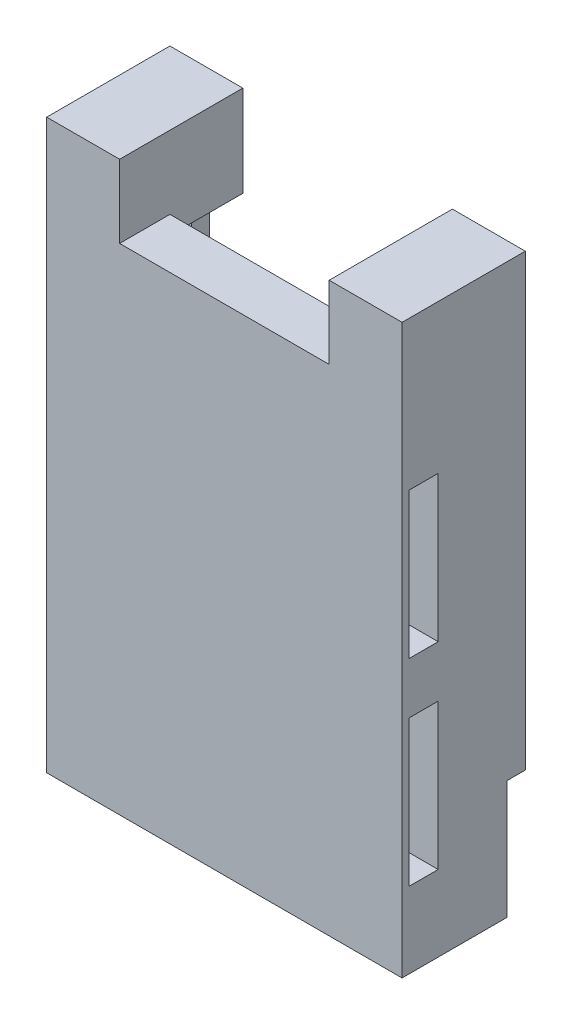
ISO-10303-21;
HEADER;
FILE_DESCRIPTION(('STEP AP214'),'2;1');
FILE_NAME('part.step','',(''),(''),'','','');
FILE_SCHEMA(('AUTOMOTIVE_DESIGN { 1 0 10303 214 1 1 1 1 }'));
ENDSEC;
DATA;
#1=APPLICATION_CONTEXT('core data for automotive mechanical design processes');
#2=APPLICATION_PROTOCOL_DEFINITION('international standard','automotive_design',2000,#1);
#3=PRODUCT_CONTEXT('',#1,'mechanical');
#4=PRODUCT('Part','Part','',(#3));
#5=PRODUCT_RELATED_PRODUCT_CATEGORY('part','',(#4));
#6=PRODUCT_DEFINITION_FORMATION('','',#4);
#7=PRODUCT_DEFINITION_CONTEXT('part definition',#1,'design');
#8=PRODUCT_DEFINITION('design','',#6,#7);
#9=PRODUCT_DEFINITION_SHAPE('','',#8);
#10=(LENGTH_UNIT() NAMED_UNIT(*) SI_UNIT(.MILLI.,.METRE.));
#11=(NAMED_UNIT(*) PLANE_ANGLE_UNIT() SI_UNIT($,.RADIAN.));
#12=(NAMED_UNIT(*) SI_UNIT($,.STERADIAN.) SOLID_ANGLE_UNIT());
#13=UNCERTAINTY_MEASURE_WITH_UNIT(LENGTH_MEASURE(1.E-05),#10,'distance_accuracy_value','');
#14=(GEOMETRIC_REPRESENTATION_CONTEXT(3) GLOBAL_UNCERTAINTY_ASSIGNED_CONTEXT((#13)) GLOBAL_UNIT_ASSIGNED_CONTEXT((#10,
#11,#12)) REPRESENTATION_CONTEXT('',''));
#15=CARTESIAN_POINT('',(0.,0.,0.));
#16=DIRECTION('',(0.,0.,1.));
#17=DIRECTION('',(1.,0.,0.));
#18=AXIS2_PLACEMENT_3D('',#15,#16,#17);
#19=CARTESIAN_POINT('',(30.9499,83.0326,-17.9858508435529));
#20=DIRECTION('',(0.,0.,1.));
#21=DIRECTION('',(1.,0.,0.));
#22=AXIS2_PLACEMENT_3D('',#19,#20,#21);
#23=PLANE('',#22);
#24=DIRECTION('',(0.,1.,0.));
#25=VECTOR('',#24,1.);
#26=CARTESIAN_POINT('',(-18.2499,83.0326,-17.9858508435529));
#27=LINE('',#26,#25);
#28=CARTESIAN_POINT('',(-18.2499,83.0326,-17.9858508435529));
#29=VERTEX_POINT('',#28);
#30=CARTESIAN_POINT('',(-18.2499,98.9076,-17.9858508435529));
#31=VERTEX_POINT('',#30);
#32=EDGE_CURVE('E284',#29,#31,#27,.T.);
#33=ORIENTED_EDGE('',*,*,#32,.F.);
#34=DIRECTION('',(-1.,0.,0.));
#35=VECTOR('',#34,1.);
#36=CARTESIAN_POINT('',(30.9499,83.0326,-17.9858508435529));
#37=LINE('',#36,#35);
#38=CARTESIAN_POINT('',(-24.0411,83.0326,-17.9858508435529));
#39=VERTEX_POINT('',#38);
#40=EDGE_CURVE('E382',#29,#39,#37,.T.);
#41=ORIENTED_EDGE('',*,*,#40,.T.);
#42=DIRECTION('',(0.,-1.,0.));
#43=VECTOR('',#42,1.);
#44=CARTESIAN_POINT('',(-24.0411,83.0326,-17.9858508435529));
#45=LINE('',#44,#43);
#46=CARTESIAN_POINT('',(-24.0411,20.63242,-17.9858508435529));
#47=VERTEX_POINT('',#46);
#48=EDGE_CURVE('E237',#39,#47,#45,.T.);
#49=ORIENTED_EDGE('',*,*,#48,.T.);
#50=DIRECTION('',(1.,0.,0.));
#51=VECTOR('',#50,1.);
#52=CARTESIAN_POINT('',(30.9499,20.63242,-17.9858508435529));
#53=LINE('',#52,#51);
#54=CARTESIAN_POINT('',(-30.9499,20.63242,-17.9858508435529));
#55=VERTEX_POINT('',#54);
#56=EDGE_CURVE('E236',#55,#47,#53,.T.);
#57=ORIENTED_EDGE('',*,*,#56,.F.);
#58=DIRECTION('',(0.,-1.,0.));
#59=VECTOR('',#58,1.);
#60=CARTESIAN_POINT('',(-30.9499,83.0326,-17.9858508435529));
#61=LINE('',#60,#59);
#62=CARTESIAN_POINT('',(-30.9499,98.9076,-17.9858508435529));
#63=VERTEX_POINT('',#62);
#64=EDGE_CURVE('E229',#63,#55,#61,.T.);
#65=ORIENTED_EDGE('',*,*,#64,.F.);
#66=DIRECTION('',(-1.,0.,0.));
#67=VECTOR('',#66,1.);
#68=CARTESIAN_POINT('',(-18.2499,98.9076,-17.9858508435529));
#69=LINE('',#68,#67);
#70=EDGE_CURVE('E234',#31,#63,#69,.T.);
#71=ORIENTED_EDGE('',*,*,#70,.F.);
#72=EDGE_LOOP('',(#33,#41,#49,#57,#65,#71));
#73=FACE_BOUND('',#72,.T.);
#74=ADVANCED_FACE('F39',(#73),#23,.F.);
#75=CARTESIAN_POINT('',(0.,83.0326,0.));
#76=DIRECTION('',(0.,1.,0.));
#77=DIRECTION('',(0.,0.,1.));
#78=AXIS2_PLACEMENT_3D('',#75,#76,#77);
#79=PLANE('',#78);
#80=DIRECTION('',(-1.,0.,0.));
#81=VECTOR('',#80,1.);
#82=CARTESIAN_POINT('',(27.7749,83.0326,-5.28585084355286));
#83=LINE('',#82,#81);
#84=CARTESIAN_POINT('',(27.7749,83.0326,-5.28585084355286));
#85=VERTEX_POINT('',#84);
#86=CARTESIAN_POINT('',(18.2499,83.0326,-5.28585084355286));
#87=VERTEX_POINT('',#86);
#88=EDGE_CURVE('E400',#85,#87,#83,.T.);
#89=ORIENTED_EDGE('',*,*,#88,.T.);
#90=DIRECTION('',(0.,0.,-1.));
#91=VECTOR('',#90,1.);
#92=CARTESIAN_POINT('',(18.2499,83.0326,-5.28585084355286));
#93=LINE('',#92,#91);
#94=CARTESIAN_POINT('',(18.2499,83.0326,-17.9858508435529));
#95=VERTEX_POINT('',#94);
#96=EDGE_CURVE('E276',#87,#95,#93,.T.);
#97=ORIENTED_EDGE('',*,*,#96,.T.);
#98=CARTESIAN_POINT('',(24.0411,83.0326,-17.9858508435529));
#99=VERTEX_POINT('',#98);
#100=EDGE_CURVE('E383',#99,#95,#37,.T.);
#101=ORIENTED_EDGE('',*,*,#100,.F.);
#102=DIRECTION('',(0.,0.,1.));
#103=VECTOR('',#102,1.);
#104=CARTESIAN_POINT('',(24.0411,83.0326,-17.9858508435529));
#105=LINE('',#104,#103);
#106=CARTESIAN_POINT('',(24.0411,83.0326,-14.8108508435529));
#107=VERTEX_POINT('',#106);
#108=EDGE_CURVE('E407',#99,#107,#105,.T.);
#109=ORIENTED_EDGE('',*,*,#108,.T.);
#110=DIRECTION('',(1.,0.,0.));
#111=VECTOR('',#110,1.);
#112=CARTESIAN_POINT('',(24.0411,83.0326,-14.8108508435529));
#113=LINE('',#112,#111);
#114=CARTESIAN_POINT('',(27.7749,83.0326,-14.8108508435529));
#115=VERTEX_POINT('',#114);
#116=EDGE_CURVE('E404',#107,#115,#113,.T.);
#117=ORIENTED_EDGE('',*,*,#116,.T.);
#118=DIRECTION('',(0.,0.,1.));
#119=VECTOR('',#118,1.);
#120=CARTESIAN_POINT('',(27.7749,83.0326,-14.8108508435529));
#121=LINE('',#120,#119);
#122=EDGE_CURVE('E405',#115,#85,#121,.T.);
#123=ORIENTED_EDGE('',*,*,#122,.T.);
#124=EDGE_LOOP('',(#89,#97,#101,#109,#117,#123));
#125=FACE_BOUND('',#124,.T.);
#126=ADVANCED_FACE('F481',(#125),#79,.F.);
#127=CARTESIAN_POINT('',(30.9499,83.0326,-17.9858508435529));
#128=DIRECTION('',(1.,0.,0.));
#129=DIRECTION('',(0.,0.,-1.));
#130=AXIS2_PLACEMENT_3D('',#127,#128,#129);
#131=PLANE('',#130);
#132=DIRECTION('',(0.,0.,-1.));
#133=VECTOR('',#132,1.);
#134=CARTESIAN_POINT('',(30.9499,72.9836457596635,0.));
#135=LINE('',#134,#133);
#136=CARTESIAN_POINT('',(30.9499,72.9836457596635,2.2655468417995));
#137=VERTEX_POINT('',#136);
#138=CARTESIAN_POINT('',(30.9499,72.9836457596635,-2.8144531582005));
#139=VERTEX_POINT('',#138);
#140=EDGE_CURVE('E320',#137,#139,#135,.T.);
#141=ORIENTED_EDGE('',*,*,#140,.T.);
#142=DIRECTION('',(0.,-1.,0.));
#143=VECTOR('',#142,1.);
#144=CARTESIAN_POINT('',(30.9499,0.,-2.81445315820049));
#145=LINE('',#144,#143);
#146=CARTESIAN_POINT('',(30.9499,47.5836457596635,-2.8144531582005));
#147=VERTEX_POINT('',#146);
#148=EDGE_CURVE('E318',#139,#147,#145,.T.);
#149=ORIENTED_EDGE('',*,*,#148,.T.);
#150=DIRECTION('',(0.,0.,-1.));
#151=VECTOR('',#150,1.);
#152=CARTESIAN_POINT('',(30.9499,47.5836457596635,0.));
#153=LINE('',#152,#151);
#154=CARTESIAN_POINT('',(30.9499,47.5836457596635,2.2655468417995));
#155=VERTEX_POINT('',#154);
#156=EDGE_CURVE('E321',#155,#147,#153,.T.);
#157=ORIENTED_EDGE('',*,*,#156,.F.);
#158=DIRECTION('',(0.,-1.,0.));
#159=VECTOR('',#158,1.);
#160=CARTESIAN_POINT('',(30.9499,0.,2.26554684179951));
#161=LINE('',#160,#159);
#162=EDGE_CURVE('E329',#137,#155,#161,.T.);
#163=ORIENTED_EDGE('',*,*,#162,.F.);
#164=EDGE_LOOP('',(#141,#149,#157,#163));
#165=FACE_BOUND('',#164,.T.);
#166=DIRECTION('',(0.,1.,0.));
#167=VECTOR('',#166,1.);
#168=CARTESIAN_POINT('',(30.9499,13.2239542403365,-2.8144531582005));
#169=LINE('',#168,#167);
#170=CARTESIAN_POINT('',(30.9499,13.2239542403365,-2.8144531582005));
#171=VERTEX_POINT('',#170);
#172=CARTESIAN_POINT('',(30.9499,38.6239542403365,-2.8144531582005));
#173=VERTEX_POINT('',#172);
#174=EDGE_CURVE('E380',#171,#173,#169,.T.);
#175=ORIENTED_EDGE('',*,*,#174,.F.);
#176=DIRECTION('',(0.,0.,-1.));
#177=VECTOR('',#176,1.);
#178=CARTESIAN_POINT('',(30.9499,13.2239542403365,2.2655468417995));
#179=LINE('',#178,#177);
#180=CARTESIAN_POINT('',(30.9499,13.2239542403365,2.2655468417995));
#181=VERTEX_POINT('',#180);
#182=EDGE_CURVE('E364',#181,#171,#179,.T.);
#183=ORIENTED_EDGE('',*,*,#182,.F.);
#184=DIRECTION('',(0.,1.,0.));
#185=VECTOR('',#184,1.);
#186=CARTESIAN_POINT('',(30.9499,13.2239542403365,2.2655468417995));
#187=LINE('',#186,#185);
#188=CARTESIAN_POINT('',(30.9499,38.6239542403365,2.2655468417995));
#189=VERTEX_POINT('',#188);
#190=EDGE_CURVE('E360',#181,#189,#187,.T.);
#191=ORIENTED_EDGE('',*,*,#190,.T.);
#192=DIRECTION('',(0.,0.,-1.));
#193=VECTOR('',#192,1.);
#194=CARTESIAN_POINT('',(30.9499,38.6239542403365,2.2655468417995));
#195=LINE('',#194,#193);
#196=EDGE_CURVE('E372',#189,#173,#195,.T.);
#197=ORIENTED_EDGE('',*,*,#196,.T.);
#198=EDGE_LOOP('',(#175,#183,#191,#197));
#199=FACE_BOUND('',#198,.T.);
#200=DIRECTION('',(0.,-1.,0.));
#201=VECTOR('',#200,1.);
#202=CARTESIAN_POINT('',(30.9499,20.63242,-14.8108508435529));
#203=LINE('',#202,#201);
#204=CARTESIAN_POINT('',(30.9499,20.63242,-14.8108508435529));
#205=VERTEX_POINT('',#204);
#206=CARTESIAN_POINT('',(30.9499,0.,-14.8108508435529));
#207=VERTEX_POINT('',#206);
#208=EDGE_CURVE('E291',#205,#207,#203,.T.);
#209=ORIENTED_EDGE('',*,*,#208,.F.);
#210=DIRECTION('',(0.,0.,-1.));
#211=VECTOR('',#210,1.);
#212=CARTESIAN_POINT('',(30.9499,20.63242,-14.8108508435529));
#213=LINE('',#212,#211);
#214=CARTESIAN_POINT('',(30.9499,20.63242,-17.9858508435529));
#215=VERTEX_POINT('',#214);
#216=EDGE_CURVE('E310',#205,#215,#213,.T.);
#217=ORIENTED_EDGE('',*,*,#216,.T.);
#218=DIRECTION('',(0.,-1.,0.));
#219=VECTOR('',#218,1.);
#220=CARTESIAN_POINT('',(30.9499,83.0326,-17.9858508435529));
#221=LINE('',#220,#219);
#222=CARTESIAN_POINT('',(30.9499,98.9076,-17.9858508435529));
#223=VERTEX_POINT('',#222);
#224=EDGE_CURVE('E422',#223,#215,#221,.T.);
#225=ORIENTED_EDGE('',*,*,#224,.F.);
#226=DIRECTION('',(0.,0.,-1.));
#227=VECTOR('',#226,1.);
#228=CARTESIAN_POINT('',(30.9499,98.9076,3.47714915644712));
#229=LINE('',#228,#227);
#230=CARTESIAN_POINT('',(30.9499,98.9076,3.47714915644712));
#231=VERTEX_POINT('',#230);
#232=EDGE_CURVE('E268',#231,#223,#229,.T.);
#233=ORIENTED_EDGE('',*,*,#232,.F.);
#234=DIRECTION('',(0.,-1.,0.));
#235=VECTOR('',#234,1.);
#236=CARTESIAN_POINT('',(30.9499,83.0326,3.47714915644712));
#237=LINE('',#236,#235);
#238=CARTESIAN_POINT('',(30.9499,0.,3.47714915644712));
#239=VERTEX_POINT('',#238);
#240=EDGE_CURVE('E409',#231,#239,#237,.T.);
#241=ORIENTED_EDGE('',*,*,#240,.T.);
#242=DIRECTION('',(0.,0.,1.));
#243=VECTOR('',#242,1.);
#244=CARTESIAN_POINT('',(30.9499,0.,-17.9858508435529));
#245=LINE('',#244,#243);
#246=EDGE_CURVE('E381',#207,#239,#245,.T.);
#247=ORIENTED_EDGE('',*,*,#246,.F.);
#248=EDGE_LOOP('',(#209,#217,#225,#233,#241,#247));
#249=FACE_BOUND('',#248,.T.);
#250=ADVANCED_FACE('F41',(#165,#199,#249),#131,.T.);
#251=CARTESIAN_POINT('',(-30.9499,83.0326,-17.9858508435529));
#252=DIRECTION('',(1.,0.,0.));
#253=DIRECTION('',(0.,0.,-1.));
#254=AXIS2_PLACEMENT_3D('',#251,#252,#253);
#255=PLANE('',#254);
#256=DIRECTION('',(0.,0.,-1.));
#257=VECTOR('',#256,1.);
#258=CARTESIAN_POINT('',(-30.9499,13.2239542403365,2.2655468417995));
#259=LINE('',#258,#257);
#260=CARTESIAN_POINT('',(-30.9499,13.2239542403365,2.2655468417995));
#261=VERTEX_POINT('',#260);
#262=CARTESIAN_POINT('',(-30.9499,13.2239542403365,-2.8144531582005));
#263=VERTEX_POINT('',#262);
#264=EDGE_CURVE('E332',#261,#263,#259,.T.);
#265=ORIENTED_EDGE('',*,*,#264,.T.);
#266=DIRECTION('',(0.,1.,0.));
#267=VECTOR('',#266,1.);
#268=CARTESIAN_POINT('',(-30.9499,13.2239542403365,-2.8144531582005));
#269=LINE('',#268,#267);
#270=CARTESIAN_POINT('',(-30.9499,38.6239542403365,-2.8144531582005));
#271=VERTEX_POINT('',#270);
#272=EDGE_CURVE('E370',#263,#271,#269,.T.);
#273=ORIENTED_EDGE('',*,*,#272,.T.);
#274=DIRECTION('',(0.,0.,-1.));
#275=VECTOR('',#274,1.);
#276=CARTESIAN_POINT('',(-30.9499,38.6239542403365,2.2655468417995));
#277=LINE('',#276,#275);
#278=CARTESIAN_POINT('',(-30.9499,38.6239542403365,2.2655468417995));
#279=VERTEX_POINT('',#278);
#280=EDGE_CURVE('E361',#279,#271,#277,.T.);
#281=ORIENTED_EDGE('',*,*,#280,.F.);
#282=DIRECTION('',(0.,1.,0.));
#283=VECTOR('',#282,1.);
#284=CARTESIAN_POINT('',(-30.9499,13.2239542403365,2.2655468417995));
#285=LINE('',#284,#283);
#286=EDGE_CURVE('E359',#261,#279,#285,.T.);
#287=ORIENTED_EDGE('',*,*,#286,.F.);
#288=EDGE_LOOP('',(#265,#273,#281,#287));
#289=FACE_BOUND('',#288,.T.);
#290=DIRECTION('',(0.,-1.,0.));
#291=VECTOR('',#290,1.);
#292=CARTESIAN_POINT('',(-30.9499,0.,-2.81445315820049));
#293=LINE('',#292,#291);
#294=CARTESIAN_POINT('',(-30.9499,72.9836457596635,-2.8144531582005));
#295=VERTEX_POINT('',#294);
#296=CARTESIAN_POINT('',(-30.9499,47.5836457596635,-2.8144531582005));
#297=VERTEX_POINT('',#296);
#298=EDGE_CURVE('E334',#295,#297,#293,.T.);
#299=ORIENTED_EDGE('',*,*,#298,.F.);
#300=DIRECTION('',(0.,0.,-1.));
#301=VECTOR('',#300,1.);
#302=CARTESIAN_POINT('',(-30.9499,72.9836457596635,0.));
#303=LINE('',#302,#301);
#304=CARTESIAN_POINT('',(-30.9499,72.9836457596635,2.2655468417995));
#305=VERTEX_POINT('',#304);
#306=EDGE_CURVE('E328',#305,#295,#303,.T.);
#307=ORIENTED_EDGE('',*,*,#306,.F.);
#308=DIRECTION('',(0.,-1.,0.));
#309=VECTOR('',#308,1.);
#310=CARTESIAN_POINT('',(-30.9499,0.,2.26554684179951));
#311=LINE('',#310,#309);
#312=CARTESIAN_POINT('',(-30.9499,47.5836457596635,2.2655468417995));
#313=VERTEX_POINT('',#312);
#314=EDGE_CURVE('E322',#305,#313,#311,.T.);
#315=ORIENTED_EDGE('',*,*,#314,.T.);
#316=DIRECTION('',(0.,0.,-1.));
#317=VECTOR('',#316,1.);
#318=CARTESIAN_POINT('',(-30.9499,47.5836457596635,0.));
#319=LINE('',#318,#317);
#320=EDGE_CURVE('E337',#313,#297,#319,.T.);
#321=ORIENTED_EDGE('',*,*,#320,.T.);
#322=EDGE_LOOP('',(#299,#307,#315,#321));
#323=FACE_BOUND('',#322,.T.);
#324=DIRECTION('',(0.,1.,0.));
#325=VECTOR('',#324,1.);
#326=CARTESIAN_POINT('',(-30.9499,0.,-14.8108508435529));
#327=LINE('',#326,#325);
#328=CARTESIAN_POINT('',(-30.9499,0.,-14.8108508435529));
#329=VERTEX_POINT('',#328);
#330=CARTESIAN_POINT('',(-30.9499,20.63242,-14.8108508435529));
#331=VERTEX_POINT('',#330);
#332=EDGE_CURVE('E300',#329,#331,#327,.T.);
#333=ORIENTED_EDGE('',*,*,#332,.F.);
#334=DIRECTION('',(0.,0.,1.));
#335=VECTOR('',#334,1.);
#336=CARTESIAN_POINT('',(-30.9499,0.,-17.9858508435529));
#337=LINE('',#336,#335);
#338=CARTESIAN_POINT('',(-30.9499,0.,3.47714915644714));
#339=VERTEX_POINT('',#338);
#340=EDGE_CURVE('E415',#329,#339,#337,.T.);
#341=ORIENTED_EDGE('',*,*,#340,.T.);
#342=DIRECTION('',(0.,-1.,0.));
#343=VECTOR('',#342,1.);
#344=CARTESIAN_POINT('',(-30.9499,83.0326,3.47714915644714));
#345=LINE('',#344,#343);
#346=CARTESIAN_POINT('',(-30.9499,98.9076,3.47714915644714));
#347=VERTEX_POINT('',#346);
#348=EDGE_CURVE('E239',#347,#339,#345,.T.);
#349=ORIENTED_EDGE('',*,*,#348,.F.);
#350=DIRECTION('',(0.,0.,1.));
#351=VECTOR('',#350,1.);
#352=CARTESIAN_POINT('',(-30.9499,98.9076,-17.9858508435529));
#353=LINE('',#352,#351);
#354=EDGE_CURVE('E243',#63,#347,#353,.T.);
#355=ORIENTED_EDGE('',*,*,#354,.F.);
#356=ORIENTED_EDGE('',*,*,#64,.T.);
#357=DIRECTION('',(0.,0.,-1.));
#358=VECTOR('',#357,1.);
#359=CARTESIAN_POINT('',(-30.9499,20.63242,-14.8108508435529));
#360=LINE('',#359,#358);
#361=EDGE_CURVE('E302',#331,#55,#360,.T.);
#362=ORIENTED_EDGE('',*,*,#361,.F.);
#363=EDGE_LOOP('',(#333,#341,#349,#355,#356,#362));
#364=FACE_BOUND('',#363,.T.);
#365=ADVANCED_FACE('F244',(#289,#323,#364),#255,.F.);
#366=CARTESIAN_POINT('',(-24.0411,83.0326,-14.8108508435529));
#367=DIRECTION('',(0.,0.,1.));
#368=DIRECTION('',(1.,0.,0.));
#369=AXIS2_PLACEMENT_3D('',#366,#367,#368);
#370=PLANE('',#369);
#371=DIRECTION('',(0.,-1.,0.));
#372=VECTOR('',#371,1.);
#373=CARTESIAN_POINT('',(-27.7749,83.0326,-14.8108508435529));
#374=LINE('',#373,#372);
#375=CARTESIAN_POINT('',(-27.7749,83.0326,-14.8108508435529));
#376=VERTEX_POINT('',#375);
#377=CARTESIAN_POINT('',(-27.7749,20.63242,-14.8108508435529));
#378=VERTEX_POINT('',#377);
#379=EDGE_CURVE('E437',#376,#378,#374,.T.);
#380=ORIENTED_EDGE('',*,*,#379,.T.);
#381=DIRECTION('',(1.,0.,0.));
#382=VECTOR('',#381,1.);
#383=CARTESIAN_POINT('',(30.9499,20.63242,-14.8108508435529));
#384=LINE('',#383,#382);
#385=CARTESIAN_POINT('',(-24.0411,20.63242,-14.8108508435529));
#386=VERTEX_POINT('',#385);
#387=EDGE_CURVE('E304',#378,#386,#384,.T.);
#388=ORIENTED_EDGE('',*,*,#387,.T.);
#389=DIRECTION('',(0.,-1.,0.));
#390=VECTOR('',#389,1.);
#391=CARTESIAN_POINT('',(-24.0411,83.0326,-14.8108508435529));
#392=LINE('',#391,#390);
#393=CARTESIAN_POINT('',(-24.0411,83.0326,-14.8108508435529));
#394=VERTEX_POINT('',#393);
#395=EDGE_CURVE('E445',#394,#386,#392,.T.);
#396=ORIENTED_EDGE('',*,*,#395,.F.);
#397=DIRECTION('',(-1.,0.,0.));
#398=VECTOR('',#397,1.);
#399=CARTESIAN_POINT('',(-24.0411,83.0326,-14.8108508435529));
#400=LINE('',#399,#398);
#401=EDGE_CURVE('E392',#394,#376,#400,.T.);
#402=ORIENTED_EDGE('',*,*,#401,.T.);
#403=EDGE_LOOP('',(#380,#388,#396,#402));
#404=FACE_BOUND('',#403,.T.);
#405=ADVANCED_FACE('F540',(#404),#370,.T.);
#406=ORIENTED_EDGE('',*,*,#100,.T.);
#407=DIRECTION('',(0.,1.,0.));
#408=VECTOR('',#407,1.);
#409=CARTESIAN_POINT('',(18.2499,83.0326,-17.9858508435529));
#410=LINE('',#409,#408);
#411=CARTESIAN_POINT('',(18.2499,98.9076,-17.9858508435529));
#412=VERTEX_POINT('',#411);
#413=EDGE_CURVE('E285',#95,#412,#410,.T.);
#414=ORIENTED_EDGE('',*,*,#413,.T.);
#415=DIRECTION('',(-1.,0.,0.));
#416=VECTOR('',#415,1.);
#417=CARTESIAN_POINT('',(30.9499,98.9076,-17.9858508435529));
#418=LINE('',#417,#416);
#419=EDGE_CURVE('E257',#223,#412,#418,.T.);
#420=ORIENTED_EDGE('',*,*,#419,.F.);
#421=ORIENTED_EDGE('',*,*,#224,.T.);
#422=CARTESIAN_POINT('',(24.0411,20.63242,-17.9858508435529));
#423=VERTEX_POINT('',#422);
#424=EDGE_CURVE('E283',#423,#215,#53,.T.);
#425=ORIENTED_EDGE('',*,*,#424,.F.);
#426=DIRECTION('',(0.,-1.,0.));
#427=VECTOR('',#426,1.);
#428=CARTESIAN_POINT('',(24.0411,83.0326,-17.9858508435529));
#429=LINE('',#428,#427);
#430=EDGE_CURVE('E424',#99,#423,#429,.T.);
#431=ORIENTED_EDGE('',*,*,#430,.F.);
#432=EDGE_LOOP('',(#406,#414,#420,#421,#425,#431));
#433=FACE_BOUND('',#432,.T.);
#434=ADVANCED_FACE('F499',(#433),#23,.F.);
#435=CARTESIAN_POINT('',(0.,0.,0.));
#436=DIRECTION('',(0.,1.,0.));
#437=DIRECTION('',(0.,0.,1.));
#438=AXIS2_PLACEMENT_3D('',#435,#436,#437);
#439=PLANE('',#438);
#440=DIRECTION('',(-1.,0.,0.));
#441=VECTOR('',#440,1.);
#442=CARTESIAN_POINT('',(30.9499,0.,-14.8108508435529));
#443=LINE('',#442,#441);
#444=CARTESIAN_POINT('',(27.7749,0.,-14.8108508435529));
#445=VERTEX_POINT('',#444);
#446=EDGE_CURVE('E294',#207,#445,#443,.T.);
#447=ORIENTED_EDGE('',*,*,#446,.F.);
#448=ORIENTED_EDGE('',*,*,#246,.T.);
#449=DIRECTION('',(1.,0.,0.));
#450=VECTOR('',#449,1.);
#451=CARTESIAN_POINT('',(-30.9499,0.,3.47714915644714));
#452=LINE('',#451,#450);
#453=EDGE_CURVE('E408',#339,#239,#452,.T.);
#454=ORIENTED_EDGE('',*,*,#453,.F.);
#455=ORIENTED_EDGE('',*,*,#340,.F.);
#456=CARTESIAN_POINT('',(-27.7749,0.,-14.8108508435529));
#457=VERTEX_POINT('',#456);
#458=EDGE_CURVE('E296',#457,#329,#443,.T.);
#459=ORIENTED_EDGE('',*,*,#458,.F.);
#460=DIRECTION('',(0.,0.,1.));
#461=VECTOR('',#460,1.);
#462=CARTESIAN_POINT('',(-27.7749,0.,-14.8108508435529));
#463=LINE('',#462,#461);
#464=CARTESIAN_POINT('',(-27.7749,0.,-5.28585084355286));
#465=VERTEX_POINT('',#464);
#466=EDGE_CURVE('E413',#457,#465,#463,.T.);
#467=ORIENTED_EDGE('',*,*,#466,.T.);
#468=DIRECTION('',(-1.,0.,0.));
#469=VECTOR('',#468,1.);
#470=CARTESIAN_POINT('',(27.7749,0.,-5.28585084355286));
#471=LINE('',#470,#469);
#472=CARTESIAN_POINT('',(27.7749,0.,-5.28585084355286));
#473=VERTEX_POINT('',#472);
#474=EDGE_CURVE('E417',#473,#465,#471,.T.);
#475=ORIENTED_EDGE('',*,*,#474,.F.);
#476=DIRECTION('',(0.,0.,1.));
#477=VECTOR('',#476,1.);
#478=CARTESIAN_POINT('',(27.7749,0.,-14.8108508435529));
#479=LINE('',#478,#477);
#480=EDGE_CURVE('E394',#445,#473,#479,.T.);
#481=ORIENTED_EDGE('',*,*,#480,.F.);
#482=EDGE_LOOP('',(#447,#448,#454,#455,#459,#467,#475,#481));
#483=FACE_BOUND('',#482,.T.);
#484=ADVANCED_FACE('F460',(#483),#439,.F.);
#485=ORIENTED_EDGE('',*,*,#40,.F.);
#486=DIRECTION('',(0.,0.,1.));
#487=VECTOR('',#486,1.);
#488=CARTESIAN_POINT('',(-18.2499,83.0326,-17.9858508435529));
#489=LINE('',#488,#487);
#490=CARTESIAN_POINT('',(-18.2499,83.0326,-5.28585084355286));
#491=VERTEX_POINT('',#490);
#492=EDGE_CURVE('E265',#29,#491,#489,.T.);
#493=ORIENTED_EDGE('',*,*,#492,.T.);
#494=CARTESIAN_POINT('',(-27.7749,83.0326,-5.28585084355286));
#495=VERTEX_POINT('',#494);
#496=EDGE_CURVE('E397',#491,#495,#83,.T.);
#497=ORIENTED_EDGE('',*,*,#496,.T.);
#498=DIRECTION('',(0.,0.,1.));
#499=VECTOR('',#498,1.);
#500=CARTESIAN_POINT('',(-27.7749,83.0326,-14.8108508435529));
#501=LINE('',#500,#499);
#502=EDGE_CURVE('E393',#376,#495,#501,.T.);
#503=ORIENTED_EDGE('',*,*,#502,.F.);
#504=ORIENTED_EDGE('',*,*,#401,.F.);
#505=DIRECTION('',(0.,0.,1.));
#506=VECTOR('',#505,1.);
#507=CARTESIAN_POINT('',(-24.0411,83.0326,-17.9858508435529));
#508=LINE('',#507,#506);
#509=EDGE_CURVE('E389',#39,#394,#508,.T.);
#510=ORIENTED_EDGE('',*,*,#509,.F.);
#511=EDGE_LOOP('',(#485,#493,#497,#503,#504,#510));
#512=FACE_BOUND('',#511,.T.);
#513=ADVANCED_FACE('F531',(#512),#79,.F.);
#514=CARTESIAN_POINT('',(24.0411,83.0326,-17.9858508435529));
#515=DIRECTION('',(1.,0.,0.));
#516=DIRECTION('',(0.,0.,-1.));
#517=AXIS2_PLACEMENT_3D('',#514,#515,#516);
#518=PLANE('',#517);
#519=ORIENTED_EDGE('',*,*,#430,.T.);
#520=DIRECTION('',(0.,0.,1.));
#521=VECTOR('',#520,1.);
#522=CARTESIAN_POINT('',(24.0411,20.63242,-17.9858508435529));
#523=LINE('',#522,#521);
#524=CARTESIAN_POINT('',(24.0411,20.63242,-14.8108508435529));
#525=VERTEX_POINT('',#524);
#526=EDGE_CURVE('E315',#423,#525,#523,.T.);
#527=ORIENTED_EDGE('',*,*,#526,.T.);
#528=DIRECTION('',(0.,-1.,0.));
#529=VECTOR('',#528,1.);
#530=CARTESIAN_POINT('',(24.0411,83.0326,-14.8108508435529));
#531=LINE('',#530,#529);
#532=EDGE_CURVE('E426',#107,#525,#531,.T.);
#533=ORIENTED_EDGE('',*,*,#532,.F.);
#534=ORIENTED_EDGE('',*,*,#108,.F.);
#535=EDGE_LOOP('',(#519,#527,#533,#534));
#536=FACE_BOUND('',#535,.T.);
#537=ADVANCED_FACE('F764',(#536),#518,.F.);
#538=CARTESIAN_POINT('',(24.0411,83.0326,-14.8108508435529));
#539=DIRECTION('',(0.,0.,-1.));
#540=DIRECTION('',(-1.,0.,0.));
#541=AXIS2_PLACEMENT_3D('',#538,#539,#540);
#542=PLANE('',#541);
#543=ORIENTED_EDGE('',*,*,#532,.T.);
#544=CARTESIAN_POINT('',(27.7749,20.63242,-14.8108508435529));
#545=VERTEX_POINT('',#544);
#546=EDGE_CURVE('E495',#525,#545,#384,.T.);
#547=ORIENTED_EDGE('',*,*,#546,.T.);
#548=DIRECTION('',(0.,-1.,0.));
#549=VECTOR('',#548,1.);
#550=CARTESIAN_POINT('',(27.7749,83.0326,-14.8108508435529));
#551=LINE('',#550,#549);
#552=EDGE_CURVE('E431',#115,#545,#551,.T.);
#553=ORIENTED_EDGE('',*,*,#552,.F.);
#554=ORIENTED_EDGE('',*,*,#116,.F.);
#555=EDGE_LOOP('',(#543,#547,#553,#554));
#556=FACE_BOUND('',#555,.T.);
#557=ADVANCED_FACE('F493',(#556),#542,.F.);
#558=CARTESIAN_POINT('',(27.7749,83.0326,-14.8108508435529));
#559=DIRECTION('',(1.,0.,0.));
#560=DIRECTION('',(0.,0.,-1.));
#561=AXIS2_PLACEMENT_3D('',#558,#559,#560);
#562=PLANE('',#561);
#563=ORIENTED_EDGE('',*,*,#480,.T.);
#564=DIRECTION('',(0.,-1.,0.));
#565=VECTOR('',#564,1.);
#566=CARTESIAN_POINT('',(27.7749,83.0326,-5.28585084355286));
#567=LINE('',#566,#565);
#568=EDGE_CURVE('E432',#85,#473,#567,.T.);
#569=ORIENTED_EDGE('',*,*,#568,.F.);
#570=ORIENTED_EDGE('',*,*,#122,.F.);
#571=ORIENTED_EDGE('',*,*,#552,.T.);
#572=EDGE_CURVE('E317',#545,#445,#551,.T.);
#573=ORIENTED_EDGE('',*,*,#572,.T.);
#574=EDGE_LOOP('',(#563,#569,#570,#571,#573));
#575=FACE_BOUND('',#574,.T.);
#576=ADVANCED_FACE('F470',(#575),#562,.F.);
#577=CARTESIAN_POINT('',(27.7749,83.0326,-5.28585084355286));
#578=DIRECTION('',(0.,0.,1.));
#579=DIRECTION('',(1.,0.,0.));
#580=AXIS2_PLACEMENT_3D('',#577,#578,#579);
#581=PLANE('',#580);
#582=ORIENTED_EDGE('',*,*,#496,.F.);
#583=DIRECTION('',(0.,1.,0.));
#584=VECTOR('',#583,1.);
#585=CARTESIAN_POINT('',(-18.2499,83.0326,-5.28585084355286));
#586=LINE('',#585,#584);
#587=CARTESIAN_POINT('',(-18.2499,86.2076,-5.28585084355286));
#588=VERTEX_POINT('',#587);
#589=EDGE_CURVE('E290',#491,#588,#586,.T.);
#590=ORIENTED_EDGE('',*,*,#589,.T.);
#591=DIRECTION('',(-1.,0.,0.));
#592=VECTOR('',#591,1.);
#593=CARTESIAN_POINT('',(8.2677,86.2076,-5.28585084355286));
#594=LINE('',#593,#592);
#595=CARTESIAN_POINT('',(18.2499,86.2076,-5.28585084355286));
#596=VERTEX_POINT('',#595);
#597=EDGE_CURVE('E344',#596,#588,#594,.T.);
#598=ORIENTED_EDGE('',*,*,#597,.F.);
#599=DIRECTION('',(0.,1.,0.));
#600=VECTOR('',#599,1.);
#601=CARTESIAN_POINT('',(18.2499,83.0326,-5.28585084355286));
#602=LINE('',#601,#600);
#603=EDGE_CURVE('E288',#87,#596,#602,.T.);
#604=ORIENTED_EDGE('',*,*,#603,.F.);
#605=ORIENTED_EDGE('',*,*,#88,.F.);
#606=ORIENTED_EDGE('',*,*,#568,.T.);
#607=ORIENTED_EDGE('',*,*,#474,.T.);
#608=DIRECTION('',(0.,-1.,0.));
#609=VECTOR('',#608,1.);
#610=CARTESIAN_POINT('',(-27.7749,83.0326,-5.28585084355286));
#611=LINE('',#610,#609);
#612=EDGE_CURVE('E440',#495,#465,#611,.T.);
#613=ORIENTED_EDGE('',*,*,#612,.F.);
#614=EDGE_LOOP('',(#582,#590,#598,#604,#605,#606,#607,#613));
#615=FACE_BOUND('',#614,.T.);
#616=ADVANCED_FACE('F484',(#615),#581,.F.);
#617=CARTESIAN_POINT('',(-27.7749,83.0326,-14.8108508435529));
#618=DIRECTION('',(1.,0.,0.));
#619=DIRECTION('',(0.,0.,-1.));
#620=AXIS2_PLACEMENT_3D('',#617,#618,#619);
#621=PLANE('',#620);
#622=ORIENTED_EDGE('',*,*,#466,.F.);
#623=EDGE_CURVE('E309',#378,#457,#374,.T.);
#624=ORIENTED_EDGE('',*,*,#623,.F.);
#625=ORIENTED_EDGE('',*,*,#379,.F.);
#626=ORIENTED_EDGE('',*,*,#502,.T.);
#627=ORIENTED_EDGE('',*,*,#612,.T.);
#628=EDGE_LOOP('',(#622,#624,#625,#626,#627));
#629=FACE_BOUND('',#628,.T.);
#630=ADVANCED_FACE('F480',(#629),#621,.T.);
#631=CARTESIAN_POINT('',(-24.0411,83.0326,-17.9858508435529));
#632=DIRECTION('',(1.,0.,0.));
#633=DIRECTION('',(0.,0.,-1.));
#634=AXIS2_PLACEMENT_3D('',#631,#632,#633);
#635=PLANE('',#634);
#636=DIRECTION('',(0.,0.,1.));
#637=VECTOR('',#636,1.);
#638=CARTESIAN_POINT('',(-24.0411,20.63242,-17.9858508435529));
#639=LINE('',#638,#637);
#640=EDGE_CURVE('E43',#47,#386,#639,.T.);
#641=ORIENTED_EDGE('',*,*,#640,.F.);
#642=ORIENTED_EDGE('',*,*,#48,.F.);
#643=ORIENTED_EDGE('',*,*,#509,.T.);
#644=ORIENTED_EDGE('',*,*,#395,.T.);
#645=EDGE_LOOP('',(#641,#642,#643,#644));
#646=FACE_BOUND('',#645,.T.);
#647=ADVANCED_FACE('F525',(#646),#635,.T.);
#648=CARTESIAN_POINT('',(-30.9499,83.0326,3.47714915644714));
#649=DIRECTION('',(0.,0.,-1.));
#650=DIRECTION('',(-1.,0.,0.));
#651=AXIS2_PLACEMENT_3D('',#648,#649,#650);
#652=PLANE('',#651);
#653=ORIENTED_EDGE('',*,*,#453,.T.);
#654=ORIENTED_EDGE('',*,*,#240,.F.);
#655=DIRECTION('',(1.,0.,0.));
#656=VECTOR('',#655,1.);
#657=CARTESIAN_POINT('',(18.2499,98.9076,3.47714915644712));
#658=LINE('',#657,#656);
#659=CARTESIAN_POINT('',(18.2499,98.9076,3.47714915644712));
#660=VERTEX_POINT('',#659);
#661=EDGE_CURVE('E266',#660,#231,#658,.T.);
#662=ORIENTED_EDGE('',*,*,#661,.F.);
#663=DIRECTION('',(0.,-1.,0.));
#664=VECTOR('',#663,1.);
#665=CARTESIAN_POINT('',(18.2499,98.9076,3.47714915644712));
#666=LINE('',#665,#664);
#667=CARTESIAN_POINT('',(18.2499,86.2076,3.47714915644712));
#668=VERTEX_POINT('',#667);
#669=EDGE_CURVE('E261',#660,#668,#666,.T.);
#670=ORIENTED_EDGE('',*,*,#669,.T.);
#671=DIRECTION('',(1.,0.,0.));
#672=VECTOR('',#671,1.);
#673=CARTESIAN_POINT('',(-30.9499,86.2076,3.47714915644714));
#674=LINE('',#673,#672);
#675=CARTESIAN_POINT('',(-18.2499,86.2076,3.47714915644713));
#676=VERTEX_POINT('',#675);
#677=EDGE_CURVE('E385',#676,#668,#674,.T.);
#678=ORIENTED_EDGE('',*,*,#677,.F.);
#679=DIRECTION('',(0.,-1.,0.));
#680=VECTOR('',#679,1.);
#681=CARTESIAN_POINT('',(-18.2499,98.9076,3.47714915644713));
#682=LINE('',#681,#680);
#683=CARTESIAN_POINT('',(-18.2499,98.9076,3.47714915644713));
#684=VERTEX_POINT('',#683);
#685=EDGE_CURVE('E258',#684,#676,#682,.T.);
#686=ORIENTED_EDGE('',*,*,#685,.F.);
#687=DIRECTION('',(1.,0.,0.));
#688=VECTOR('',#687,1.);
#689=CARTESIAN_POINT('',(-30.9499,98.9076,3.47714915644714));
#690=LINE('',#689,#688);
#691=EDGE_CURVE('E248',#347,#684,#690,.T.);
#692=ORIENTED_EDGE('',*,*,#691,.F.);
#693=ORIENTED_EDGE('',*,*,#348,.T.);
#694=EDGE_LOOP('',(#653,#654,#662,#670,#678,#686,#692,#693));
#695=FACE_BOUND('',#694,.T.);
#696=ADVANCED_FACE('F451',(#695),#652,.F.);
#697=CARTESIAN_POINT('',(0.,86.2076,0.));
#698=DIRECTION('',(0.,1.,0.));
#699=DIRECTION('',(0.,0.,1.));
#700=AXIS2_PLACEMENT_3D('',#697,#698,#699);
#701=PLANE('',#700);
#702=DIRECTION('',(0.,0.,-1.));
#703=VECTOR('',#702,1.);
#704=CARTESIAN_POINT('',(-18.2499,86.2076,3.47714915644713));
#705=LINE('',#704,#703);
#706=EDGE_CURVE('E54',#676,#588,#705,.T.);
#707=ORIENTED_EDGE('',*,*,#706,.F.);
#708=ORIENTED_EDGE('',*,*,#677,.T.);
#709=DIRECTION('',(0.,0.,1.));
#710=VECTOR('',#709,1.);
#711=CARTESIAN_POINT('',(18.2499,86.2076,-17.9858508435529));
#712=LINE('',#711,#710);
#713=EDGE_CURVE('E11',#596,#668,#712,.T.);
#714=ORIENTED_EDGE('',*,*,#713,.F.);
#715=ORIENTED_EDGE('',*,*,#597,.T.);
#716=EDGE_LOOP('',(#707,#708,#714,#715));
#717=FACE_BOUND('',#716,.T.);
#718=ADVANCED_FACE('F512',(#717),#701,.T.);
#719=CARTESIAN_POINT('',(30.9499,13.2239542403365,2.2655468417995));
#720=DIRECTION('',(0.,1.,0.));
#721=DIRECTION('',(0.,0.,1.));
#722=AXIS2_PLACEMENT_3D('',#719,#720,#721);
#723=PLANE('',#722);
#724=ORIENTED_EDGE('',*,*,#264,.F.);
#725=DIRECTION('',(-1.,0.,0.));
#726=VECTOR('',#725,1.);
#727=CARTESIAN_POINT('',(30.9499,13.2239542403365,2.2655468417995));
#728=LINE('',#727,#726);
#729=EDGE_CURVE('E358',#181,#261,#728,.T.);
#730=ORIENTED_EDGE('',*,*,#729,.F.);
#731=ORIENTED_EDGE('',*,*,#182,.T.);
#732=DIRECTION('',(-1.,0.,0.));
#733=VECTOR('',#732,1.);
#734=CARTESIAN_POINT('',(30.9499,13.2239542403365,-2.8144531582005));
#735=LINE('',#734,#733);
#736=EDGE_CURVE('E314',#171,#263,#735,.T.);
#737=ORIENTED_EDGE('',*,*,#736,.T.);
#738=EDGE_LOOP('',(#724,#730,#731,#737));
#739=FACE_BOUND('',#738,.T.);
#740=ADVANCED_FACE('F514',(#739),#723,.T.);
#741=CARTESIAN_POINT('',(30.9499,13.2239542403365,-2.8144531582005));
#742=DIRECTION('',(0.,0.,1.));
#743=DIRECTION('',(0.,-1.,0.));
#744=AXIS2_PLACEMENT_3D('',#741,#742,#743);
#745=PLANE('',#744);
#746=ORIENTED_EDGE('',*,*,#272,.F.);
#747=ORIENTED_EDGE('',*,*,#736,.F.);
#748=ORIENTED_EDGE('',*,*,#174,.T.);
#749=DIRECTION('',(-1.,0.,0.));
#750=VECTOR('',#749,1.);
#751=CARTESIAN_POINT('',(30.9499,38.6239542403365,-2.8144531582005));
#752=LINE('',#751,#750);
#753=EDGE_CURVE('E354',#173,#271,#752,.T.);
#754=ORIENTED_EDGE('',*,*,#753,.T.);
#755=EDGE_LOOP('',(#746,#747,#748,#754));
#756=FACE_BOUND('',#755,.T.);
#757=ADVANCED_FACE('F518',(#756),#745,.T.);
#758=CARTESIAN_POINT('',(30.9499,38.6239542403365,2.2655468417995));
#759=DIRECTION('',(0.,1.,0.));
#760=DIRECTION('',(0.,0.,1.));
#761=AXIS2_PLACEMENT_3D('',#758,#759,#760);
#762=PLANE('',#761);
#763=ORIENTED_EDGE('',*,*,#280,.T.);
#764=ORIENTED_EDGE('',*,*,#753,.F.);
#765=ORIENTED_EDGE('',*,*,#196,.F.);
#766=DIRECTION('',(-1.,0.,0.));
#767=VECTOR('',#766,1.);
#768=CARTESIAN_POINT('',(30.9499,38.6239542403365,2.2655468417995));
#769=LINE('',#768,#767);
#770=EDGE_CURVE('E355',#189,#279,#769,.T.);
#771=ORIENTED_EDGE('',*,*,#770,.T.);
#772=EDGE_LOOP('',(#763,#764,#765,#771));
#773=FACE_BOUND('',#772,.T.);
#774=ADVANCED_FACE('F736',(#773),#762,.F.);
#775=CARTESIAN_POINT('',(30.9499,13.2239542403365,2.2655468417995));
#776=DIRECTION('',(0.,0.,1.));
#777=DIRECTION('',(0.,-1.,0.));
#778=AXIS2_PLACEMENT_3D('',#775,#776,#777);
#779=PLANE('',#778);
#780=ORIENTED_EDGE('',*,*,#286,.T.);
#781=ORIENTED_EDGE('',*,*,#770,.F.);
#782=ORIENTED_EDGE('',*,*,#190,.F.);
#783=ORIENTED_EDGE('',*,*,#729,.T.);
#784=EDGE_LOOP('',(#780,#781,#782,#783));
#785=FACE_BOUND('',#784,.T.);
#786=ADVANCED_FACE('F728',(#785),#779,.F.);
#787=CARTESIAN_POINT('',(30.9499,72.9836457596635,0.));
#788=DIRECTION('',(0.,1.,0.));
#789=DIRECTION('',(0.,0.,1.));
#790=AXIS2_PLACEMENT_3D('',#787,#788,#789);
#791=PLANE('',#790);
#792=ORIENTED_EDGE('',*,*,#306,.T.);
#793=DIRECTION('',(-1.,0.,0.));
#794=VECTOR('',#793,1.);
#795=CARTESIAN_POINT('',(30.9499,72.9836457596635,-2.8144531582005));
#796=LINE('',#795,#794);
#797=EDGE_CURVE('E326',#139,#295,#796,.T.);
#798=ORIENTED_EDGE('',*,*,#797,.F.);
#799=ORIENTED_EDGE('',*,*,#140,.F.);
#800=DIRECTION('',(-1.,0.,0.));
#801=VECTOR('',#800,1.);
#802=CARTESIAN_POINT('',(30.9499,72.9836457596635,2.2655468417995));
#803=LINE('',#802,#801);
#804=EDGE_CURVE('E342',#137,#305,#803,.T.);
#805=ORIENTED_EDGE('',*,*,#804,.T.);
#806=EDGE_LOOP('',(#792,#798,#799,#805));
#807=FACE_BOUND('',#806,.T.);
#808=ADVANCED_FACE('F724',(#807),#791,.F.);
#809=CARTESIAN_POINT('',(30.9499,0.,2.26554684179951));
#810=DIRECTION('',(0.,0.,-1.));
#811=DIRECTION('',(0.,1.,0.));
#812=AXIS2_PLACEMENT_3D('',#809,#810,#811);
#813=PLANE('',#812);
#814=ORIENTED_EDGE('',*,*,#314,.F.);
#815=ORIENTED_EDGE('',*,*,#804,.F.);
#816=ORIENTED_EDGE('',*,*,#162,.T.);
#817=DIRECTION('',(-1.,0.,0.));
#818=VECTOR('',#817,1.);
#819=CARTESIAN_POINT('',(30.9499,47.5836457596635,2.2655468417995));
#820=LINE('',#819,#818);
#821=EDGE_CURVE('E341',#155,#313,#820,.T.);
#822=ORIENTED_EDGE('',*,*,#821,.T.);
#823=EDGE_LOOP('',(#814,#815,#816,#822));
#824=FACE_BOUND('',#823,.T.);
#825=ADVANCED_FACE('F714',(#824),#813,.T.);
#826=CARTESIAN_POINT('',(30.9499,47.5836457596635,0.));
#827=DIRECTION('',(0.,1.,0.));
#828=DIRECTION('',(0.,0.,1.));
#829=AXIS2_PLACEMENT_3D('',#826,#827,#828);
#830=PLANE('',#829);
#831=ORIENTED_EDGE('',*,*,#320,.F.);
#832=ORIENTED_EDGE('',*,*,#821,.F.);
#833=ORIENTED_EDGE('',*,*,#156,.T.);
#834=DIRECTION('',(-1.,0.,0.));
#835=VECTOR('',#834,1.);
#836=CARTESIAN_POINT('',(30.9499,47.5836457596635,-2.8144531582005));
#837=LINE('',#836,#835);
#838=EDGE_CURVE('E347',#147,#297,#837,.T.);
#839=ORIENTED_EDGE('',*,*,#838,.T.);
#840=EDGE_LOOP('',(#831,#832,#833,#839));
#841=FACE_BOUND('',#840,.T.);
#842=ADVANCED_FACE('F573',(#841),#830,.T.);
#843=CARTESIAN_POINT('',(30.9499,0.,-2.81445315820049));
#844=DIRECTION('',(0.,0.,-1.));
#845=DIRECTION('',(0.,1.,0.));
#846=AXIS2_PLACEMENT_3D('',#843,#844,#845);
#847=PLANE('',#846);
#848=ORIENTED_EDGE('',*,*,#298,.T.);
#849=ORIENTED_EDGE('',*,*,#838,.F.);
#850=ORIENTED_EDGE('',*,*,#148,.F.);
#851=ORIENTED_EDGE('',*,*,#797,.T.);
#852=EDGE_LOOP('',(#848,#849,#850,#851));
#853=FACE_BOUND('',#852,.T.);
#854=ADVANCED_FACE('F568',(#853),#847,.F.);
#855=CARTESIAN_POINT('',(30.9499,20.63242,-14.8108508435529));
#856=DIRECTION('',(0.,1.,0.));
#857=DIRECTION('',(0.,0.,1.));
#858=AXIS2_PLACEMENT_3D('',#855,#856,#857);
#859=PLANE('',#858);
#860=ORIENTED_EDGE('',*,*,#640,.T.);
#861=ORIENTED_EDGE('',*,*,#387,.F.);
#862=EDGE_CURVE('E301',#331,#378,#384,.T.);
#863=ORIENTED_EDGE('',*,*,#862,.F.);
#864=ORIENTED_EDGE('',*,*,#361,.T.);
#865=ORIENTED_EDGE('',*,*,#56,.T.);
#866=EDGE_LOOP('',(#860,#861,#863,#864,#865));
#867=FACE_BOUND('',#866,.T.);
#868=ADVANCED_FACE('F570',(#867),#859,.F.);
#869=CARTESIAN_POINT('',(0.,0.,-14.8108508435529));
#870=DIRECTION('',(0.,0.,-1.));
#871=DIRECTION('',(-1.,0.,0.));
#872=AXIS2_PLACEMENT_3D('',#869,#870,#871);
#873=PLANE('',#872);
#874=ORIENTED_EDGE('',*,*,#623,.T.);
#875=ORIENTED_EDGE('',*,*,#458,.T.);
#876=ORIENTED_EDGE('',*,*,#332,.T.);
#877=ORIENTED_EDGE('',*,*,#862,.T.);
#878=EDGE_LOOP('',(#874,#875,#876,#877));
#879=FACE_BOUND('',#878,.T.);
#880=ADVANCED_FACE('F474',(#879),#873,.T.);
#881=ORIENTED_EDGE('',*,*,#424,.T.);
#882=ORIENTED_EDGE('',*,*,#216,.F.);
#883=EDGE_CURVE('E297',#545,#205,#384,.T.);
#884=ORIENTED_EDGE('',*,*,#883,.F.);
#885=ORIENTED_EDGE('',*,*,#546,.F.);
#886=ORIENTED_EDGE('',*,*,#526,.F.);
#887=EDGE_LOOP('',(#881,#882,#884,#885,#886));
#888=FACE_BOUND('',#887,.T.);
#889=ADVANCED_FACE('F496',(#888),#859,.F.);
#890=ORIENTED_EDGE('',*,*,#883,.T.);
#891=ORIENTED_EDGE('',*,*,#208,.T.);
#892=ORIENTED_EDGE('',*,*,#446,.T.);
#893=ORIENTED_EDGE('',*,*,#572,.F.);
#894=EDGE_LOOP('',(#890,#891,#892,#893));
#895=FACE_BOUND('',#894,.T.);
#896=ADVANCED_FACE('F465',(#895),#873,.T.);
#897=CARTESIAN_POINT('',(18.2499,83.0326,-5.28585084355286));
#898=DIRECTION('',(1.,0.,0.));
#899=DIRECTION('',(0.,0.,-1.));
#900=AXIS2_PLACEMENT_3D('',#897,#898,#899);
#901=PLANE('',#900);
#902=ORIENTED_EDGE('',*,*,#603,.T.);
#903=ORIENTED_EDGE('',*,*,#713,.T.);
#904=ORIENTED_EDGE('',*,*,#669,.F.);
#905=DIRECTION('',(0.,0.,1.));
#906=VECTOR('',#905,1.);
#907=CARTESIAN_POINT('',(18.2499,98.9076,-17.9858508435529));
#908=LINE('',#907,#906);
#909=EDGE_CURVE('E271',#412,#660,#908,.T.);
#910=ORIENTED_EDGE('',*,*,#909,.F.);
#911=ORIENTED_EDGE('',*,*,#413,.F.);
#912=ORIENTED_EDGE('',*,*,#96,.F.);
#913=EDGE_LOOP('',(#902,#903,#904,#910,#911,#912));
#914=FACE_BOUND('',#913,.T.);
#915=ADVANCED_FACE('F508',(#914),#901,.F.);
#916=CARTESIAN_POINT('',(-18.2499,83.0326,-17.9858508435529));
#917=DIRECTION('',(-1.,0.,0.));
#918=DIRECTION('',(0.,0.,1.));
#919=AXIS2_PLACEMENT_3D('',#916,#917,#918);
#920=PLANE('',#919);
#921=ORIENTED_EDGE('',*,*,#32,.T.);
#922=DIRECTION('',(0.,0.,-1.));
#923=VECTOR('',#922,1.);
#924=CARTESIAN_POINT('',(-18.2499,98.9076,3.47714915644713));
#925=LINE('',#924,#923);
#926=EDGE_CURVE('E251',#684,#31,#925,.T.);
#927=ORIENTED_EDGE('',*,*,#926,.F.);
#928=ORIENTED_EDGE('',*,*,#685,.T.);
#929=ORIENTED_EDGE('',*,*,#706,.T.);
#930=ORIENTED_EDGE('',*,*,#589,.F.);
#931=ORIENTED_EDGE('',*,*,#492,.F.);
#932=EDGE_LOOP('',(#921,#927,#928,#929,#930,#931));
#933=FACE_BOUND('',#932,.T.);
#934=ADVANCED_FACE('F581',(#933),#920,.F.);
#935=CARTESIAN_POINT('',(0.,98.9076,0.));
#936=DIRECTION('',(0.,1.,0.));
#937=DIRECTION('',(0.,0.,1.));
#938=AXIS2_PLACEMENT_3D('',#935,#936,#937);
#939=PLANE('',#938);
#940=ORIENTED_EDGE('',*,*,#419,.T.);
#941=ORIENTED_EDGE('',*,*,#909,.T.);
#942=ORIENTED_EDGE('',*,*,#661,.T.);
#943=ORIENTED_EDGE('',*,*,#232,.T.);
#944=EDGE_LOOP('',(#940,#941,#942,#943));
#945=FACE_BOUND('',#944,.T.);
#946=ADVANCED_FACE('F502',(#945),#939,.T.);
#947=CARTESIAN_POINT('',(0.,98.9076,0.));
#948=DIRECTION('',(0.,1.,0.));
#949=DIRECTION('',(0.,0.,1.));
#950=AXIS2_PLACEMENT_3D('',#947,#948,#949);
#951=PLANE('',#950);
#952=ORIENTED_EDGE('',*,*,#70,.T.);
#953=ORIENTED_EDGE('',*,*,#354,.T.);
#954=ORIENTED_EDGE('',*,*,#691,.T.);
#955=ORIENTED_EDGE('',*,*,#926,.T.);
#956=EDGE_LOOP('',(#952,#953,#954,#955));
#957=FACE_BOUND('',#956,.T.);
#958=ADVANCED_FACE('F255',(#957),#951,.T.);
#959=CLOSED_SHELL('',(#74,#126,#250,#365,#405,#434,#484,#513,#537,#557,#576,#616,#630,#647,#696,
#718,#740,#757,#774,#786,#808,#825,#842,#854,#868,#880,#889,#896,#915,#934,#946,#958));
#960=MANIFOLD_SOLID_BREP('B2',#959);
#961=ADVANCED_BREP_SHAPE_REPRESENTATION('',(#18,#960),#14);
#962=SHAPE_DEFINITION_REPRESENTATION(#9,#961);
ENDSEC;
END-ISO-10303-21;
